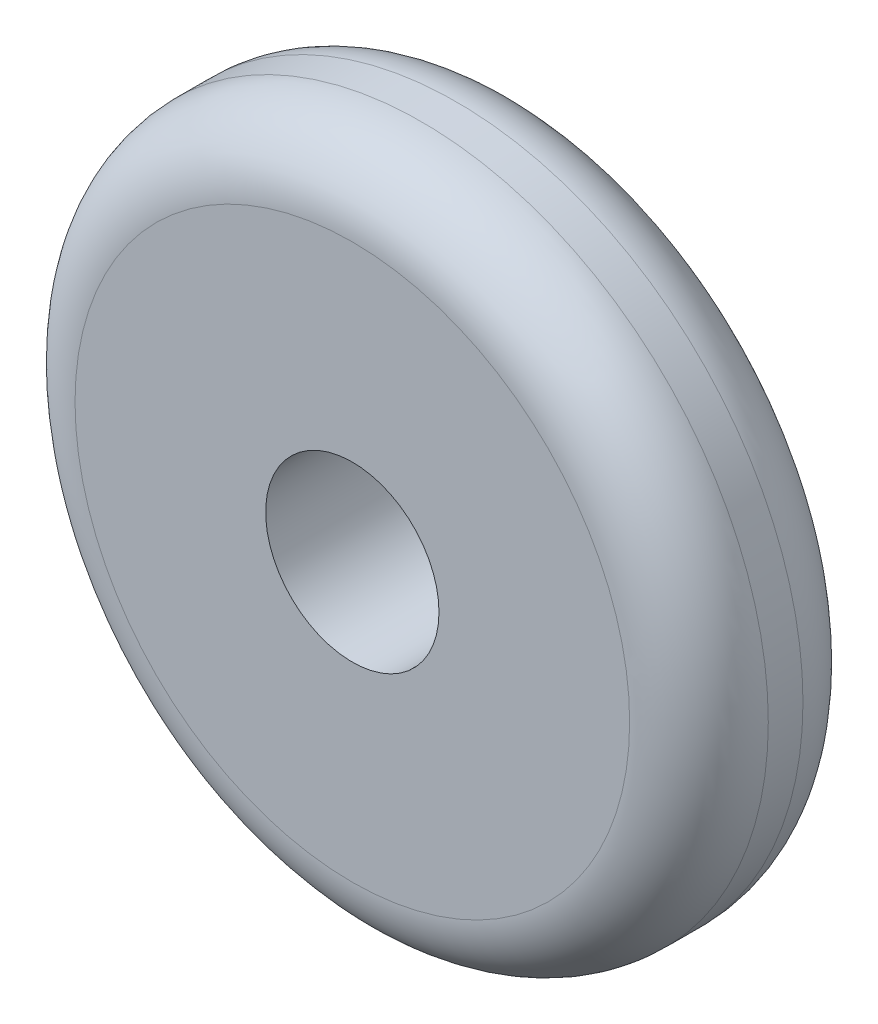
ISO-10303-21;
HEADER;
FILE_DESCRIPTION(('STEP AP214'),'2;1');
FILE_NAME('part.step','',(''),(''),'','','');
FILE_SCHEMA(('AUTOMOTIVE_DESIGN { 1 0 10303 214 1 1 1 1 }'));
ENDSEC;
DATA;
#1=APPLICATION_CONTEXT('core data for automotive mechanical design processes');
#2=APPLICATION_PROTOCOL_DEFINITION('international standard','automotive_design',2000,#1);
#3=PRODUCT_CONTEXT('',#1,'mechanical');
#4=PRODUCT('Part','Part','',(#3));
#5=PRODUCT_RELATED_PRODUCT_CATEGORY('part','',(#4));
#6=PRODUCT_DEFINITION_FORMATION('','',#4);
#7=PRODUCT_DEFINITION_CONTEXT('part definition',#1,'design');
#8=PRODUCT_DEFINITION('design','',#6,#7);
#9=PRODUCT_DEFINITION_SHAPE('','',#8);
#10=(LENGTH_UNIT() NAMED_UNIT(*) SI_UNIT(.MILLI.,.METRE.));
#11=(NAMED_UNIT(*) PLANE_ANGLE_UNIT() SI_UNIT($,.RADIAN.));
#12=(NAMED_UNIT(*) SI_UNIT($,.STERADIAN.) SOLID_ANGLE_UNIT());
#13=UNCERTAINTY_MEASURE_WITH_UNIT(LENGTH_MEASURE(1.E-05),#10,'distance_accuracy_value','');
#14=(GEOMETRIC_REPRESENTATION_CONTEXT(3) GLOBAL_UNCERTAINTY_ASSIGNED_CONTEXT((#13)) GLOBAL_UNIT_ASSIGNED_CONTEXT((#10,
#11,#12)) REPRESENTATION_CONTEXT('',''));
#15=CARTESIAN_POINT('',(0.,0.,0.));
#16=DIRECTION('',(0.,0.,1.));
#17=DIRECTION('',(1.,0.,0.));
#18=AXIS2_PLACEMENT_3D('',#15,#16,#17);
#19=CARTESIAN_POINT('',(0.,0.,12.7));
#20=DIRECTION('',(0.,0.,1.));
#21=DIRECTION('',(1.,0.,0.));
#22=AXIS2_PLACEMENT_3D('',#19,#20,#21);
#23=PLANE('',#22);
#24=CARTESIAN_POINT('',(0.,0.,12.7));
#25=DIRECTION('',(0.,0.,1.));
#26=DIRECTION('',(1.,0.,0.));
#27=AXIS2_PLACEMENT_3D('',#24,#25,#26);
#28=CIRCLE('',#27,20.32);
#29=CARTESIAN_POINT('',(20.32,0.,12.7));
#30=VERTEX_POINT('',#29);
#31=EDGE_CURVE('E10',#30,#30,#28,.T.);
#32=ORIENTED_EDGE('',*,*,#31,.T.);
#33=EDGE_LOOP('',(#32));
#34=FACE_BOUND('',#33,.T.);
#35=CARTESIAN_POINT('',(0.,0.,12.7));
#36=DIRECTION('',(0.,0.,1.));
#37=DIRECTION('',(1.,0.,0.));
#38=AXIS2_PLACEMENT_3D('',#35,#36,#37);
#39=CIRCLE('',#38,6.35);
#40=CARTESIAN_POINT('',(6.35,0.,12.7));
#41=VERTEX_POINT('',#40);
#42=EDGE_CURVE('E61',#41,#41,#39,.T.);
#43=ORIENTED_EDGE('',*,*,#42,.F.);
#44=EDGE_LOOP('',(#43));
#45=FACE_BOUND('',#44,.T.);
#46=ADVANCED_FACE('F37',(#34,#45),#23,.T.);
#47=CARTESIAN_POINT('',(0.,0.,0.));
#48=DIRECTION('',(0.,0.,1.));
#49=DIRECTION('',(1.,0.,0.));
#50=AXIS2_PLACEMENT_3D('',#47,#48,#49);
#51=PLANE('',#50);
#52=CARTESIAN_POINT('',(0.,0.,0.));
#53=DIRECTION('',(0.,0.,1.));
#54=DIRECTION('',(1.,0.,0.));
#55=AXIS2_PLACEMENT_3D('',#52,#53,#54);
#56=CIRCLE('',#55,20.32);
#57=CARTESIAN_POINT('',(20.32,0.,0.));
#58=VERTEX_POINT('',#57);
#59=EDGE_CURVE('E45',#58,#58,#56,.F.);
#60=ORIENTED_EDGE('',*,*,#59,.T.);
#61=EDGE_LOOP('',(#60));
#62=FACE_BOUND('',#61,.T.);
#63=CARTESIAN_POINT('',(0.,0.,0.));
#64=DIRECTION('',(0.,0.,1.));
#65=DIRECTION('',(1.,0.,0.));
#66=AXIS2_PLACEMENT_3D('',#63,#64,#65);
#67=CIRCLE('',#66,6.35);
#68=CARTESIAN_POINT('',(6.35,0.,0.));
#69=VERTEX_POINT('',#68);
#70=EDGE_CURVE('E62',#69,#69,#67,.T.);
#71=ORIENTED_EDGE('',*,*,#70,.T.);
#72=EDGE_LOOP('',(#71));
#73=FACE_BOUND('',#72,.T.);
#74=ADVANCED_FACE('F74',(#62,#73),#51,.F.);
#75=CARTESIAN_POINT('',(0.,0.,12.7));
#76=DIRECTION('',(0.,0.,-1.));
#77=DIRECTION('',(-1.,0.,0.));
#78=AXIS2_PLACEMENT_3D('',#75,#76,#77);
#79=CYLINDRICAL_SURFACE('',#78,25.4);
#80=CARTESIAN_POINT('',(0.,0.,5.08));
#81=DIRECTION('',(0.,0.,1.));
#82=DIRECTION('',(1.,0.,0.));
#83=AXIS2_PLACEMENT_3D('',#80,#81,#82);
#84=CIRCLE('',#83,25.4);
#85=CARTESIAN_POINT('',(25.4,0.,5.08));
#86=VERTEX_POINT('',#85);
#87=EDGE_CURVE('E50',#86,#86,#84,.T.);
#88=ORIENTED_EDGE('',*,*,#87,.T.);
#89=EDGE_LOOP('',(#88));
#90=FACE_BOUND('',#89,.T.);
#91=CARTESIAN_POINT('',(0.,0.,7.62));
#92=DIRECTION('',(0.,0.,1.));
#93=DIRECTION('',(1.,0.,0.));
#94=AXIS2_PLACEMENT_3D('',#91,#92,#93);
#95=CIRCLE('',#94,25.4);
#96=CARTESIAN_POINT('',(25.4,0.,7.62));
#97=VERTEX_POINT('',#96);
#98=EDGE_CURVE('E55',#97,#97,#95,.F.);
#99=ORIENTED_EDGE('',*,*,#98,.T.);
#100=EDGE_LOOP('',(#99));
#101=FACE_BOUND('',#100,.T.);
#102=ADVANCED_FACE('F79',(#90,#101),#79,.T.);
#103=CARTESIAN_POINT('',(0.,0.,12.7));
#104=DIRECTION('',(0.,0.,-1.));
#105=DIRECTION('',(-1.,0.,0.));
#106=AXIS2_PLACEMENT_3D('',#103,#104,#105);
#107=CYLINDRICAL_SURFACE('',#106,6.35);
#108=ORIENTED_EDGE('',*,*,#42,.T.);
#109=EDGE_LOOP('',(#108));
#110=FACE_BOUND('',#109,.T.);
#111=ORIENTED_EDGE('',*,*,#70,.F.);
#112=EDGE_LOOP('',(#111));
#113=FACE_BOUND('',#112,.T.);
#114=ADVANCED_FACE('F70',(#110,#113),#107,.F.);
#115=CARTESIAN_POINT('',(0.,0.,5.08));
#116=DIRECTION('',(0.,0.,1.));
#117=DIRECTION('',(1.,0.,0.));
#118=AXIS2_PLACEMENT_3D('',#115,#116,#117);
#119=TOROIDAL_SURFACE('',#118,20.32,5.08);
#120=ORIENTED_EDGE('',*,*,#59,.F.);
#121=EDGE_LOOP('',(#120));
#122=FACE_BOUND('',#121,.T.);
#123=ORIENTED_EDGE('',*,*,#87,.F.);
#124=EDGE_LOOP('',(#123));
#125=FACE_BOUND('',#124,.T.);
#126=ADVANCED_FACE('F85',(#122,#125),#119,.T.);
#127=CARTESIAN_POINT('',(0.,0.,7.62));
#128=DIRECTION('',(0.,0.,1.));
#129=DIRECTION('',(1.,0.,0.));
#130=AXIS2_PLACEMENT_3D('',#127,#128,#129);
#131=TOROIDAL_SURFACE('',#130,20.32,5.08);
#132=ORIENTED_EDGE('',*,*,#98,.F.);
#133=EDGE_LOOP('',(#132));
#134=FACE_BOUND('',#133,.T.);
#135=ORIENTED_EDGE('',*,*,#31,.F.);
#136=EDGE_LOOP('',(#135));
#137=FACE_BOUND('',#136,.T.);
#138=ADVANCED_FACE('F39',(#134,#137),#131,.T.);
#139=CLOSED_SHELL('',(#46,#74,#102,#114,#126,#138));
#140=MANIFOLD_SOLID_BREP('B2',#139);
#141=ADVANCED_BREP_SHAPE_REPRESENTATION('',(#18,#140),#14);
#142=SHAPE_DEFINITION_REPRESENTATION(#9,#141);
ENDSEC;
END-ISO-10303-21;
